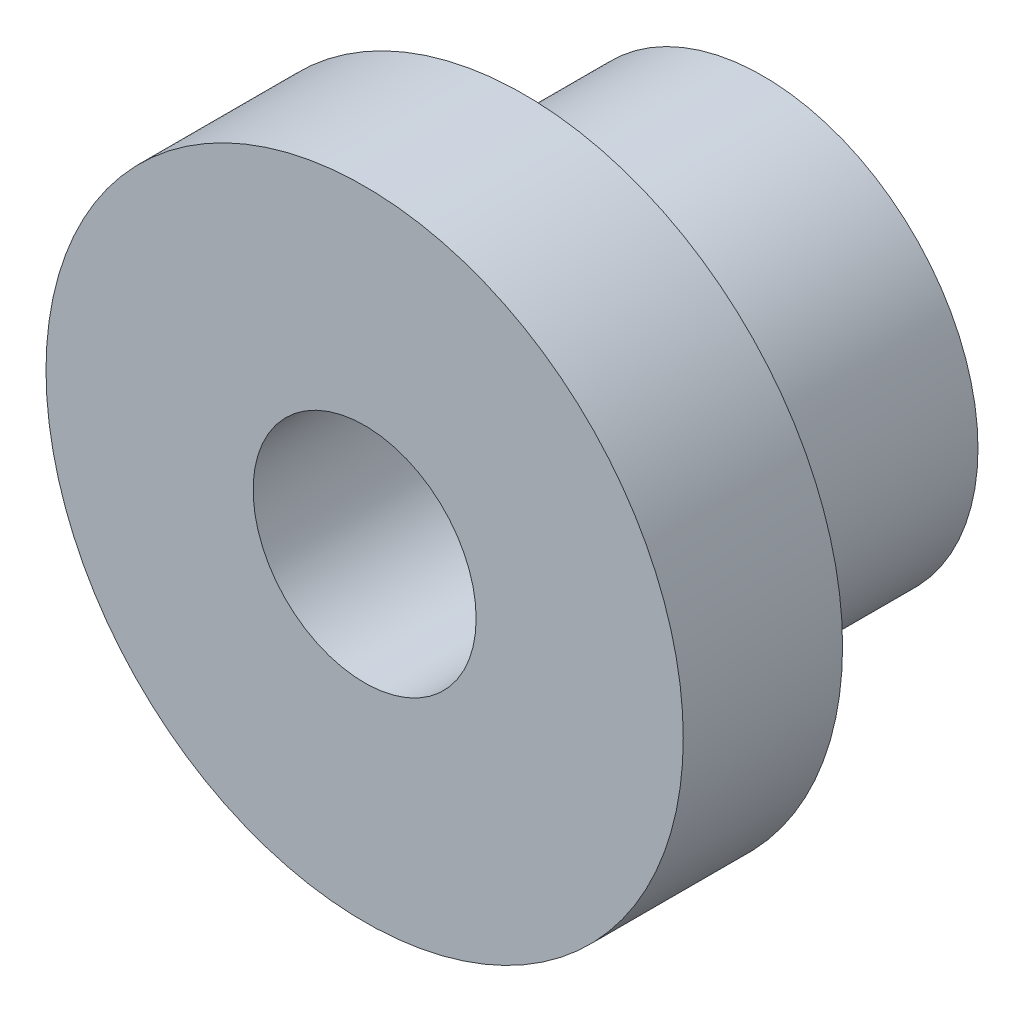
ISO-10303-21;
HEADER;
FILE_DESCRIPTION(('STEP AP214'),'2;1');
FILE_NAME('part.step','',(''),(''),'','','');
FILE_SCHEMA(('AUTOMOTIVE_DESIGN { 1 0 10303 214 1 1 1 1 }'));
ENDSEC;
DATA;
#1=APPLICATION_CONTEXT('core data for automotive mechanical design processes');
#2=APPLICATION_PROTOCOL_DEFINITION('international standard','automotive_design',2000,#1);
#3=PRODUCT_CONTEXT('',#1,'mechanical');
#4=PRODUCT('Part','Part','',(#3));
#5=PRODUCT_RELATED_PRODUCT_CATEGORY('part','',(#4));
#6=PRODUCT_DEFINITION_FORMATION('','',#4);
#7=PRODUCT_DEFINITION_CONTEXT('part definition',#1,'design');
#8=PRODUCT_DEFINITION('design','',#6,#7);
#9=PRODUCT_DEFINITION_SHAPE('','',#8);
#10=(LENGTH_UNIT() NAMED_UNIT(*) SI_UNIT(.MILLI.,.METRE.));
#11=(NAMED_UNIT(*) PLANE_ANGLE_UNIT() SI_UNIT($,.RADIAN.));
#12=(NAMED_UNIT(*) SI_UNIT($,.STERADIAN.) SOLID_ANGLE_UNIT());
#13=UNCERTAINTY_MEASURE_WITH_UNIT(LENGTH_MEASURE(1.E-05),#10,'distance_accuracy_value','');
#14=(GEOMETRIC_REPRESENTATION_CONTEXT(3) GLOBAL_UNCERTAINTY_ASSIGNED_CONTEXT((#13)) GLOBAL_UNIT_ASSIGNED_CONTEXT((#10,
#11,#12)) REPRESENTATION_CONTEXT('',''));
#15=CARTESIAN_POINT('',(0.,0.,0.));
#16=DIRECTION('',(0.,0.,1.));
#17=DIRECTION('',(1.,0.,0.));
#18=AXIS2_PLACEMENT_3D('',#15,#16,#17);
#19=CARTESIAN_POINT('',(0.,0.,0.));
#20=DIRECTION('',(0.,0.,1.));
#21=DIRECTION('',(1.,0.,0.));
#22=AXIS2_PLACEMENT_3D('',#19,#20,#21);
#23=PLANE('',#22);
#24=CARTESIAN_POINT('',(0.,0.,0.));
#25=DIRECTION('',(0.,0.,1.));
#26=DIRECTION('',(1.,0.,0.));
#27=AXIS2_PLACEMENT_3D('',#24,#25,#26);
#28=CIRCLE('',#27,2.7);
#29=CARTESIAN_POINT('',(2.7,0.,0.));
#30=VERTEX_POINT('',#29);
#31=EDGE_CURVE('E47',#30,#30,#28,.T.);
#32=ORIENTED_EDGE('',*,*,#31,.F.);
#33=EDGE_LOOP('',(#32));
#34=FACE_BOUND('',#33,.T.);
#35=CARTESIAN_POINT('',(0.,0.,0.));
#36=DIRECTION('',(0.,0.,1.));
#37=DIRECTION('',(1.,0.,0.));
#38=AXIS2_PLACEMENT_3D('',#35,#36,#37);
#39=CIRCLE('',#38,1.65);
#40=CARTESIAN_POINT('',(1.65,0.,0.));
#41=VERTEX_POINT('',#40);
#42=EDGE_CURVE('E56',#41,#41,#39,.T.);
#43=ORIENTED_EDGE('',*,*,#42,.T.);
#44=EDGE_LOOP('',(#43));
#45=FACE_BOUND('',#44,.T.);
#46=ADVANCED_FACE('F43',(#34,#45),#23,.F.);
#47=CARTESIAN_POINT('',(0.,0.,3.));
#48=DIRECTION('',(0.,0.,-1.));
#49=DIRECTION('',(-1.,0.,0.));
#50=AXIS2_PLACEMENT_3D('',#47,#48,#49);
#51=CYLINDRICAL_SURFACE('',#50,2.7);
#52=CARTESIAN_POINT('',(0.,0.,3.));
#53=DIRECTION('',(0.,0.,1.));
#54=DIRECTION('',(1.,0.,0.));
#55=AXIS2_PLACEMENT_3D('',#52,#53,#54);
#56=CIRCLE('',#55,2.7);
#57=CARTESIAN_POINT('',(2.7,0.,3.));
#58=VERTEX_POINT('',#57);
#59=EDGE_CURVE('E10',#58,#58,#56,.T.);
#60=ORIENTED_EDGE('',*,*,#59,.F.);
#61=EDGE_LOOP('',(#60));
#62=FACE_BOUND('',#61,.T.);
#63=ORIENTED_EDGE('',*,*,#31,.T.);
#64=EDGE_LOOP('',(#63));
#65=FACE_BOUND('',#64,.T.);
#66=ADVANCED_FACE('F45',(#62,#65),#51,.T.);
#67=CARTESIAN_POINT('',(0.,0.,3.));
#68=DIRECTION('',(0.,0.,-1.));
#69=DIRECTION('',(-1.,0.,0.));
#70=AXIS2_PLACEMENT_3D('',#67,#68,#69);
#71=CYLINDRICAL_SURFACE('',#70,1.65);
#72=CARTESIAN_POINT('',(0.,0.,3.));
#73=DIRECTION('',(0.,0.,1.));
#74=DIRECTION('',(1.,0.,0.));
#75=AXIS2_PLACEMENT_3D('',#72,#73,#74);
#76=CIRCLE('',#75,1.65);
#77=CARTESIAN_POINT('',(1.65,0.,3.));
#78=VERTEX_POINT('',#77);
#79=EDGE_CURVE('E61',#78,#78,#76,.T.);
#80=ORIENTED_EDGE('',*,*,#79,.T.);
#81=EDGE_LOOP('',(#80));
#82=FACE_BOUND('',#81,.T.);
#83=ORIENTED_EDGE('',*,*,#42,.F.);
#84=EDGE_LOOP('',(#83));
#85=FACE_BOUND('',#84,.T.);
#86=ADVANCED_FACE('F97',(#82,#85),#71,.F.);
#87=CARTESIAN_POINT('',(0.,0.,3.));
#88=DIRECTION('',(0.,0.,1.));
#89=DIRECTION('',(1.,0.,0.));
#90=AXIS2_PLACEMENT_3D('',#87,#88,#89);
#91=PLANE('',#90);
#92=CARTESIAN_POINT('',(0.,0.,3.));
#93=DIRECTION('',(0.,0.,1.));
#94=DIRECTION('',(1.,0.,0.));
#95=AXIS2_PLACEMENT_3D('',#92,#93,#94);
#96=CIRCLE('',#95,1.4);
#97=CARTESIAN_POINT('',(1.4,0.,3.));
#98=VERTEX_POINT('',#97);
#99=EDGE_CURVE('E74',#98,#98,#96,.T.);
#100=ORIENTED_EDGE('',*,*,#99,.T.);
#101=EDGE_LOOP('',(#100));
#102=FACE_BOUND('',#101,.T.);
#103=ORIENTED_EDGE('',*,*,#79,.F.);
#104=EDGE_LOOP('',(#103));
#105=FACE_BOUND('',#104,.T.);
#106=ADVANCED_FACE('F88',(#102,#105),#91,.F.);
#107=CARTESIAN_POINT('',(0.,0.,5.));
#108=DIRECTION('',(0.,0.,1.));
#109=DIRECTION('',(1.,0.,0.));
#110=AXIS2_PLACEMENT_3D('',#107,#108,#109);
#111=PLANE('',#110);
#112=CARTESIAN_POINT('',(0.,0.,5.));
#113=DIRECTION('',(0.,0.,1.));
#114=DIRECTION('',(1.,0.,0.));
#115=AXIS2_PLACEMENT_3D('',#112,#113,#114);
#116=CIRCLE('',#115,4.);
#117=CARTESIAN_POINT('',(4.,0.,5.));
#118=VERTEX_POINT('',#117);
#119=EDGE_CURVE('E65',#118,#118,#116,.T.);
#120=ORIENTED_EDGE('',*,*,#119,.T.);
#121=EDGE_LOOP('',(#120));
#122=FACE_BOUND('',#121,.T.);
#123=CARTESIAN_POINT('',(0.,0.,5.));
#124=DIRECTION('',(0.,0.,1.));
#125=DIRECTION('',(1.,0.,0.));
#126=AXIS2_PLACEMENT_3D('',#123,#124,#125);
#127=CIRCLE('',#126,1.4);
#128=CARTESIAN_POINT('',(1.4,0.,5.));
#129=VERTEX_POINT('',#128);
#130=EDGE_CURVE('E70',#129,#129,#127,.T.);
#131=ORIENTED_EDGE('',*,*,#130,.F.);
#132=EDGE_LOOP('',(#131));
#133=FACE_BOUND('',#132,.T.);
#134=ADVANCED_FACE('F85',(#122,#133),#111,.T.);
#135=ORIENTED_EDGE('',*,*,#59,.T.);
#136=EDGE_LOOP('',(#135));
#137=FACE_BOUND('',#136,.T.);
#138=CARTESIAN_POINT('',(0.,0.,3.));
#139=DIRECTION('',(0.,0.,1.));
#140=DIRECTION('',(1.,0.,0.));
#141=AXIS2_PLACEMENT_3D('',#138,#139,#140);
#142=CIRCLE('',#141,4.);
#143=CARTESIAN_POINT('',(4.,0.,3.));
#144=VERTEX_POINT('',#143);
#145=EDGE_CURVE('E66',#144,#144,#142,.T.);
#146=ORIENTED_EDGE('',*,*,#145,.F.);
#147=EDGE_LOOP('',(#146));
#148=FACE_BOUND('',#147,.T.);
#149=ADVANCED_FACE('F87',(#137,#148),#91,.F.);
#150=CARTESIAN_POINT('',(0.,0.,5.));
#151=DIRECTION('',(0.,0.,-1.));
#152=DIRECTION('',(-1.,0.,0.));
#153=AXIS2_PLACEMENT_3D('',#150,#151,#152);
#154=CYLINDRICAL_SURFACE('',#153,4.);
#155=ORIENTED_EDGE('',*,*,#119,.F.);
#156=EDGE_LOOP('',(#155));
#157=FACE_BOUND('',#156,.T.);
#158=ORIENTED_EDGE('',*,*,#145,.T.);
#159=EDGE_LOOP('',(#158));
#160=FACE_BOUND('',#159,.T.);
#161=ADVANCED_FACE('F95',(#157,#160),#154,.T.);
#162=CARTESIAN_POINT('',(0.,0.,5.));
#163=DIRECTION('',(0.,0.,-1.));
#164=DIRECTION('',(-1.,0.,0.));
#165=AXIS2_PLACEMENT_3D('',#162,#163,#164);
#166=CYLINDRICAL_SURFACE('',#165,1.4);
#167=ORIENTED_EDGE('',*,*,#130,.T.);
#168=EDGE_LOOP('',(#167));
#169=FACE_BOUND('',#168,.T.);
#170=ORIENTED_EDGE('',*,*,#99,.F.);
#171=EDGE_LOOP('',(#170));
#172=FACE_BOUND('',#171,.T.);
#173=ADVANCED_FACE('F82',(#169,#172),#166,.F.);
#174=CLOSED_SHELL('',(#46,#66,#86,#106,#134,#149,#161,#173));
#175=MANIFOLD_SOLID_BREP('B2',#174);
#176=ADVANCED_BREP_SHAPE_REPRESENTATION('',(#18,#175),#14);
#177=SHAPE_DEFINITION_REPRESENTATION(#9,#176);
ENDSEC;
END-ISO-10303-21;
